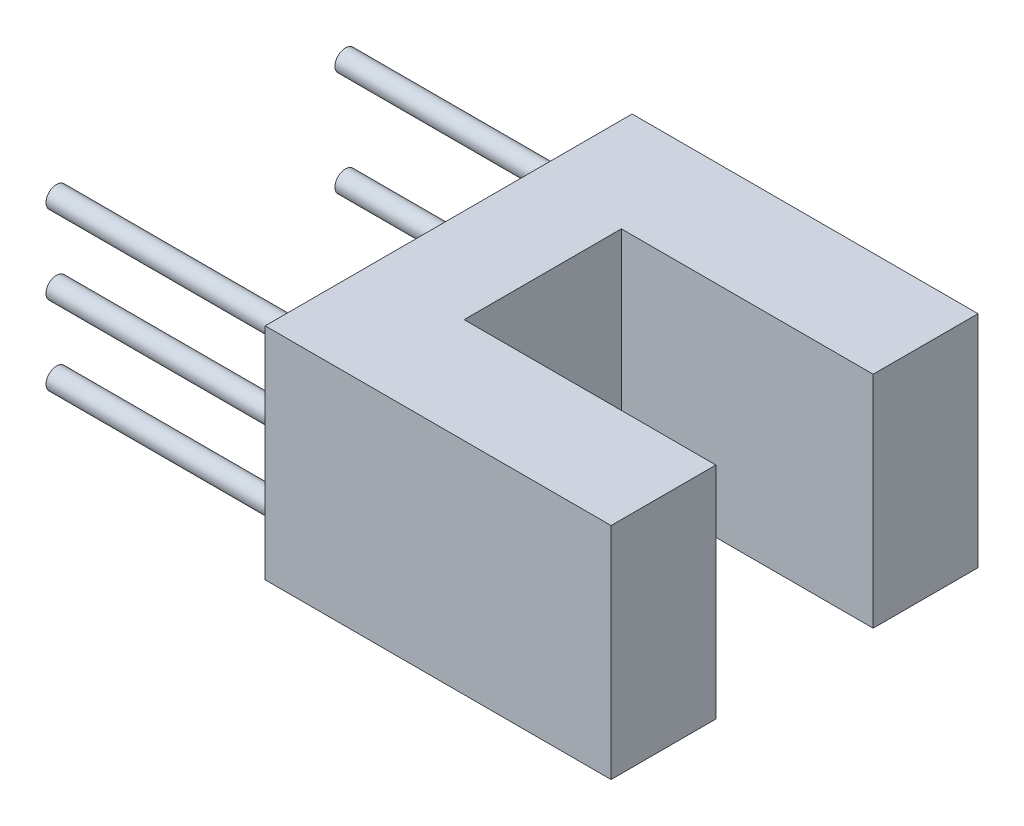
ISO-10303-21;
HEADER;
FILE_DESCRIPTION(('STEP AP214'),'2;1');
FILE_NAME('part.step','',(''),(''),'','','');
FILE_SCHEMA(('AUTOMOTIVE_DESIGN { 1 0 10303 214 1 1 1 1 }'));
ENDSEC;
DATA;
#1=APPLICATION_CONTEXT('core data for automotive mechanical design processes');
#2=APPLICATION_PROTOCOL_DEFINITION('international standard','automotive_design',2000,#1);
#3=PRODUCT_CONTEXT('',#1,'mechanical');
#4=PRODUCT('Part','Part','',(#3));
#5=PRODUCT_RELATED_PRODUCT_CATEGORY('part','',(#4));
#6=PRODUCT_DEFINITION_FORMATION('','',#4);
#7=PRODUCT_DEFINITION_CONTEXT('part definition',#1,'design');
#8=PRODUCT_DEFINITION('design','',#6,#7);
#9=PRODUCT_DEFINITION_SHAPE('','',#8);
#10=(LENGTH_UNIT() NAMED_UNIT(*) SI_UNIT(.MILLI.,.METRE.));
#11=(NAMED_UNIT(*) PLANE_ANGLE_UNIT() SI_UNIT($,.RADIAN.));
#12=(NAMED_UNIT(*) SI_UNIT($,.STERADIAN.) SOLID_ANGLE_UNIT());
#13=UNCERTAINTY_MEASURE_WITH_UNIT(LENGTH_MEASURE(1.E-05),#10,'distance_accuracy_value','');
#14=(GEOMETRIC_REPRESENTATION_CONTEXT(3) GLOBAL_UNCERTAINTY_ASSIGNED_CONTEXT((#13)) GLOBAL_UNIT_ASSIGNED_CONTEXT((#10,
#11,#12)) REPRESENTATION_CONTEXT('',''));
#15=CARTESIAN_POINT('',(0.,0.,0.));
#16=DIRECTION('',(0.,0.,1.));
#17=DIRECTION('',(1.,0.,0.));
#18=AXIS2_PLACEMENT_3D('',#15,#16,#17);
#19=CARTESIAN_POINT('',(8.38,0.,0.));
#20=DIRECTION('',(-1.,0.,0.));
#21=DIRECTION('',(0.,0.,1.));
#22=AXIS2_PLACEMENT_3D('',#19,#20,#21);
#23=PLANE('',#22);
#24=DIRECTION('',(0.,0.,-1.));
#25=VECTOR('',#24,1.);
#26=CARTESIAN_POINT('',(8.38,0.,0.));
#27=LINE('',#26,#25);
#28=CARTESIAN_POINT('',(8.38,0.,0.));
#29=VERTEX_POINT('',#28);
#30=CARTESIAN_POINT('',(8.38,0.,-2.54));
#31=VERTEX_POINT('',#30);
#32=EDGE_CURVE('E90',#29,#31,#27,.T.);
#33=ORIENTED_EDGE('',*,*,#32,.T.);
#34=DIRECTION('',(0.,-1.,0.));
#35=VECTOR('',#34,1.);
#36=CARTESIAN_POINT('',(8.38,5.33,-2.54));
#37=LINE('',#36,#35);
#38=CARTESIAN_POINT('',(8.38,5.33,-2.54));
#39=VERTEX_POINT('',#38);
#40=EDGE_CURVE('E116',#39,#31,#37,.T.);
#41=ORIENTED_EDGE('',*,*,#40,.F.);
#42=DIRECTION('',(0.,0.,1.));
#43=VECTOR('',#42,1.);
#44=CARTESIAN_POINT('',(8.38,5.33,0.));
#45=LINE('',#44,#43);
#46=CARTESIAN_POINT('',(8.38,5.33,0.));
#47=VERTEX_POINT('',#46);
#48=EDGE_CURVE('E61',#39,#47,#45,.T.);
#49=ORIENTED_EDGE('',*,*,#48,.T.);
#50=DIRECTION('',(0.,-1.,0.));
#51=VECTOR('',#50,1.);
#52=CARTESIAN_POINT('',(8.38,0.,0.));
#53=LINE('',#52,#51);
#54=EDGE_CURVE('E147',#47,#29,#53,.T.);
#55=ORIENTED_EDGE('',*,*,#54,.T.);
#56=EDGE_LOOP('',(#33,#41,#49,#55));
#57=FACE_BOUND('',#56,.T.);
#58=ADVANCED_FACE('F37',(#57),#23,.F.);
#59=CARTESIAN_POINT('',(8.38,0.,0.));
#60=DIRECTION('',(0.,0.,-1.));
#61=DIRECTION('',(-1.,0.,0.));
#62=AXIS2_PLACEMENT_3D('',#59,#60,#61);
#63=PLANE('',#62);
#64=DIRECTION('',(0.,-1.,0.));
#65=VECTOR('',#64,1.);
#66=CARTESIAN_POINT('',(0.,0.,0.));
#67=LINE('',#66,#65);
#68=CARTESIAN_POINT('',(0.,5.33,0.));
#69=VERTEX_POINT('',#68);
#70=CARTESIAN_POINT('',(0.,0.,0.));
#71=VERTEX_POINT('',#70);
#72=EDGE_CURVE('E142',#69,#71,#67,.T.);
#73=ORIENTED_EDGE('',*,*,#72,.T.);
#74=DIRECTION('',(-1.,0.,0.));
#75=VECTOR('',#74,1.);
#76=CARTESIAN_POINT('',(8.38,0.,0.));
#77=LINE('',#76,#75);
#78=EDGE_CURVE('E11',#29,#71,#77,.T.);
#79=ORIENTED_EDGE('',*,*,#78,.F.);
#80=ORIENTED_EDGE('',*,*,#54,.F.);
#81=DIRECTION('',(-1.,0.,0.));
#82=VECTOR('',#81,1.);
#83=CARTESIAN_POINT('',(8.38,5.33,0.));
#84=LINE('',#83,#82);
#85=EDGE_CURVE('E156',#47,#69,#84,.T.);
#86=ORIENTED_EDGE('',*,*,#85,.T.);
#87=EDGE_LOOP('',(#73,#79,#80,#86));
#88=FACE_BOUND('',#87,.T.);
#89=ADVANCED_FACE('F39',(#88),#63,.F.);
#90=CARTESIAN_POINT('',(8.38,0.,0.));
#91=DIRECTION('',(0.,1.,0.));
#92=DIRECTION('',(0.,0.,1.));
#93=AXIS2_PLACEMENT_3D('',#90,#91,#92);
#94=PLANE('',#93);
#95=DIRECTION('',(0.,0.,-1.));
#96=VECTOR('',#95,1.);
#97=CARTESIAN_POINT('',(2.28,0.,-2.54));
#98=LINE('',#97,#96);
#99=CARTESIAN_POINT('',(2.28,0.,-2.54));
#100=VERTEX_POINT('',#99);
#101=CARTESIAN_POINT('',(2.28,0.,-6.35));
#102=VERTEX_POINT('',#101);
#103=EDGE_CURVE('E124',#100,#102,#98,.T.);
#104=ORIENTED_EDGE('',*,*,#103,.F.);
#105=DIRECTION('',(1.,0.,0.));
#106=VECTOR('',#105,1.);
#107=CARTESIAN_POINT('',(2.28,0.,-2.54));
#108=LINE('',#107,#106);
#109=EDGE_CURVE('E111',#100,#31,#108,.T.);
#110=ORIENTED_EDGE('',*,*,#109,.T.);
#111=ORIENTED_EDGE('',*,*,#32,.F.);
#112=ORIENTED_EDGE('',*,*,#78,.T.);
#113=DIRECTION('',(0.,0.,-1.));
#114=VECTOR('',#113,1.);
#115=CARTESIAN_POINT('',(0.,0.,0.));
#116=LINE('',#115,#114);
#117=CARTESIAN_POINT('',(0.,0.,-8.89));
#118=VERTEX_POINT('',#117);
#119=EDGE_CURVE('E159',#71,#118,#116,.T.);
#120=ORIENTED_EDGE('',*,*,#119,.T.);
#121=DIRECTION('',(-1.,0.,0.));
#122=VECTOR('',#121,1.);
#123=CARTESIAN_POINT('',(8.38,0.,-8.89));
#124=LINE('',#123,#122);
#125=CARTESIAN_POINT('',(8.38,0.,-8.89));
#126=VERTEX_POINT('',#125);
#127=EDGE_CURVE('E45',#126,#118,#124,.T.);
#128=ORIENTED_EDGE('',*,*,#127,.F.);
#129=CARTESIAN_POINT('',(8.38,0.,-6.35));
#130=VERTEX_POINT('',#129);
#131=EDGE_CURVE('E149',#130,#126,#27,.T.);
#132=ORIENTED_EDGE('',*,*,#131,.F.);
#133=DIRECTION('',(1.,0.,0.));
#134=VECTOR('',#133,1.);
#135=CARTESIAN_POINT('',(2.28,0.,-6.35));
#136=LINE('',#135,#134);
#137=EDGE_CURVE('E52',#102,#130,#136,.T.);
#138=ORIENTED_EDGE('',*,*,#137,.F.);
#139=EDGE_LOOP('',(#104,#110,#111,#112,#120,#128,#132,#138));
#140=FACE_BOUND('',#139,.T.);
#141=ADVANCED_FACE('F129',(#140),#94,.F.);
#142=CARTESIAN_POINT('',(8.38,0.,-8.89));
#143=DIRECTION('',(0.,0.,1.));
#144=DIRECTION('',(1.,0.,0.));
#145=AXIS2_PLACEMENT_3D('',#142,#143,#144);
#146=PLANE('',#145);
#147=DIRECTION('',(0.,1.,0.));
#148=VECTOR('',#147,1.);
#149=CARTESIAN_POINT('',(0.,0.,-8.89));
#150=LINE('',#149,#148);
#151=CARTESIAN_POINT('',(0.,5.33,-8.89));
#152=VERTEX_POINT('',#151);
#153=EDGE_CURVE('E161',#118,#152,#150,.T.);
#154=ORIENTED_EDGE('',*,*,#153,.T.);
#155=DIRECTION('',(-1.,0.,0.));
#156=VECTOR('',#155,1.);
#157=CARTESIAN_POINT('',(8.38,5.33,-8.89));
#158=LINE('',#157,#156);
#159=CARTESIAN_POINT('',(8.38,5.33,-8.89));
#160=VERTEX_POINT('',#159);
#161=EDGE_CURVE('E165',#160,#152,#158,.T.);
#162=ORIENTED_EDGE('',*,*,#161,.F.);
#163=DIRECTION('',(0.,1.,0.));
#164=VECTOR('',#163,1.);
#165=CARTESIAN_POINT('',(8.38,0.,-8.89));
#166=LINE('',#165,#164);
#167=EDGE_CURVE('E151',#126,#160,#166,.T.);
#168=ORIENTED_EDGE('',*,*,#167,.F.);
#169=ORIENTED_EDGE('',*,*,#127,.T.);
#170=EDGE_LOOP('',(#154,#162,#168,#169));
#171=FACE_BOUND('',#170,.T.);
#172=ADVANCED_FACE('F171',(#171),#146,.F.);
#173=CARTESIAN_POINT('',(8.38,5.33,0.));
#174=DIRECTION('',(0.,-1.,0.));
#175=DIRECTION('',(0.,0.,-1.));
#176=AXIS2_PLACEMENT_3D('',#173,#174,#175);
#177=PLANE('',#176);
#178=ORIENTED_EDGE('',*,*,#48,.F.);
#179=DIRECTION('',(1.,0.,0.));
#180=VECTOR('',#179,1.);
#181=CARTESIAN_POINT('',(2.28,5.33,-2.54));
#182=LINE('',#181,#180);
#183=CARTESIAN_POINT('',(2.28,5.33,-2.54));
#184=VERTEX_POINT('',#183);
#185=EDGE_CURVE('E140',#184,#39,#182,.T.);
#186=ORIENTED_EDGE('',*,*,#185,.F.);
#187=DIRECTION('',(0.,0.,1.));
#188=VECTOR('',#187,1.);
#189=CARTESIAN_POINT('',(2.28,5.33,-2.54));
#190=LINE('',#189,#188);
#191=CARTESIAN_POINT('',(2.28,5.33,-6.35));
#192=VERTEX_POINT('',#191);
#193=EDGE_CURVE('E118',#192,#184,#190,.T.);
#194=ORIENTED_EDGE('',*,*,#193,.F.);
#195=DIRECTION('',(1.,0.,0.));
#196=VECTOR('',#195,1.);
#197=CARTESIAN_POINT('',(2.28,5.33,-6.35));
#198=LINE('',#197,#196);
#199=CARTESIAN_POINT('',(8.38,5.33,-6.35));
#200=VERTEX_POINT('',#199);
#201=EDGE_CURVE('E143',#192,#200,#198,.T.);
#202=ORIENTED_EDGE('',*,*,#201,.T.);
#203=EDGE_CURVE('E153',#160,#200,#45,.T.);
#204=ORIENTED_EDGE('',*,*,#203,.F.);
#205=ORIENTED_EDGE('',*,*,#161,.T.);
#206=DIRECTION('',(0.,0.,1.));
#207=VECTOR('',#206,1.);
#208=CARTESIAN_POINT('',(0.,5.33,0.));
#209=LINE('',#208,#207);
#210=EDGE_CURVE('E83',#152,#69,#209,.T.);
#211=ORIENTED_EDGE('',*,*,#210,.T.);
#212=ORIENTED_EDGE('',*,*,#85,.F.);
#213=EDGE_LOOP('',(#178,#186,#194,#202,#204,#205,#211,#212));
#214=FACE_BOUND('',#213,.T.);
#215=ADVANCED_FACE('F179',(#214),#177,.F.);
#216=ORIENTED_EDGE('',*,*,#203,.T.);
#217=DIRECTION('',(0.,1.,0.));
#218=VECTOR('',#217,1.);
#219=CARTESIAN_POINT('',(8.38,5.33,-6.35));
#220=LINE('',#219,#218);
#221=EDGE_CURVE('E127',#130,#200,#220,.T.);
#222=ORIENTED_EDGE('',*,*,#221,.F.);
#223=ORIENTED_EDGE('',*,*,#131,.T.);
#224=ORIENTED_EDGE('',*,*,#167,.T.);
#225=EDGE_LOOP('',(#216,#222,#223,#224));
#226=FACE_BOUND('',#225,.T.);
#227=ADVANCED_FACE('F182',(#226),#23,.F.);
#228=CARTESIAN_POINT('',(0.,0.,0.));
#229=DIRECTION('',(-1.,0.,0.));
#230=DIRECTION('',(0.,0.,1.));
#231=AXIS2_PLACEMENT_3D('',#228,#229,#230);
#232=PLANE('',#231);
#233=CARTESIAN_POINT('',(0.,0.76,-0.945));
#234=DIRECTION('',(-1.,0.,0.));
#235=DIRECTION('',(0.,0.,1.));
#236=AXIS2_PLACEMENT_3D('',#233,#234,#235);
#237=CIRCLE('',#236,0.255);
#238=CARTESIAN_POINT('',(0.,0.76,-0.69));
#239=VERTEX_POINT('',#238);
#240=EDGE_CURVE('E253',#239,#239,#237,.T.);
#241=ORIENTED_EDGE('',*,*,#240,.F.);
#242=EDGE_LOOP('',(#241));
#243=FACE_BOUND('',#242,.T.);
#244=CARTESIAN_POINT('',(0.,2.665,-0.945000000000001));
#245=DIRECTION('',(-1.,0.,0.));
#246=DIRECTION('',(0.,0.,1.));
#247=AXIS2_PLACEMENT_3D('',#244,#245,#246);
#248=CIRCLE('',#247,0.255);
#249=CARTESIAN_POINT('',(0.,2.665,-0.690000000000001));
#250=VERTEX_POINT('',#249);
#251=EDGE_CURVE('E257',#250,#250,#248,.T.);
#252=ORIENTED_EDGE('',*,*,#251,.F.);
#253=EDGE_LOOP('',(#252));
#254=FACE_BOUND('',#253,.T.);
#255=CARTESIAN_POINT('',(0.,4.57,-0.945));
#256=DIRECTION('',(-1.,0.,0.));
#257=DIRECTION('',(0.,0.,1.));
#258=AXIS2_PLACEMENT_3D('',#255,#256,#257);
#259=CIRCLE('',#258,0.255);
#260=CARTESIAN_POINT('',(0.,4.57,-0.69));
#261=VERTEX_POINT('',#260);
#262=EDGE_CURVE('E264',#261,#261,#259,.T.);
#263=ORIENTED_EDGE('',*,*,#262,.F.);
#264=EDGE_LOOP('',(#263));
#265=FACE_BOUND('',#264,.T.);
#266=CARTESIAN_POINT('',(0.,1.395,-7.945));
#267=DIRECTION('',(-1.,0.,0.));
#268=DIRECTION('',(0.,0.,1.));
#269=AXIS2_PLACEMENT_3D('',#266,#267,#268);
#270=CIRCLE('',#269,0.255);
#271=CARTESIAN_POINT('',(0.,1.395,-7.69));
#272=VERTEX_POINT('',#271);
#273=EDGE_CURVE('E270',#272,#272,#270,.T.);
#274=ORIENTED_EDGE('',*,*,#273,.F.);
#275=EDGE_LOOP('',(#274));
#276=FACE_BOUND('',#275,.T.);
#277=CARTESIAN_POINT('',(0.,3.935,-7.945));
#278=DIRECTION('',(-1.,0.,0.));
#279=DIRECTION('',(0.,0.,1.));
#280=AXIS2_PLACEMENT_3D('',#277,#278,#279);
#281=CIRCLE('',#280,0.255);
#282=CARTESIAN_POINT('',(0.,3.935,-7.69));
#283=VERTEX_POINT('',#282);
#284=EDGE_CURVE('E273',#283,#283,#281,.T.);
#285=ORIENTED_EDGE('',*,*,#284,.F.);
#286=EDGE_LOOP('',(#285));
#287=FACE_BOUND('',#286,.T.);
#288=ORIENTED_EDGE('',*,*,#72,.F.);
#289=ORIENTED_EDGE('',*,*,#210,.F.);
#290=ORIENTED_EDGE('',*,*,#153,.F.);
#291=ORIENTED_EDGE('',*,*,#119,.F.);
#292=EDGE_LOOP('',(#288,#289,#290,#291));
#293=FACE_BOUND('',#292,.T.);
#294=ADVANCED_FACE('F175',(#243,#254,#265,#276,#287,#293),#232,.T.);
#295=CARTESIAN_POINT('',(2.28,5.33,-2.54));
#296=DIRECTION('',(0.,0.,1.));
#297=DIRECTION('',(0.,-1.,0.));
#298=AXIS2_PLACEMENT_3D('',#295,#296,#297);
#299=PLANE('',#298);
#300=ORIENTED_EDGE('',*,*,#40,.T.);
#301=ORIENTED_EDGE('',*,*,#109,.F.);
#302=DIRECTION('',(0.,-1.,0.));
#303=VECTOR('',#302,1.);
#304=CARTESIAN_POINT('',(2.28,5.33,-2.54));
#305=LINE('',#304,#303);
#306=EDGE_CURVE('E114',#184,#100,#305,.T.);
#307=ORIENTED_EDGE('',*,*,#306,.F.);
#308=ORIENTED_EDGE('',*,*,#185,.T.);
#309=EDGE_LOOP('',(#300,#301,#307,#308));
#310=FACE_BOUND('',#309,.T.);
#311=ADVANCED_FACE('F113',(#310),#299,.F.);
#312=CARTESIAN_POINT('',(2.28,5.33,-6.35));
#313=DIRECTION('',(0.,0.,-1.));
#314=DIRECTION('',(0.,1.,0.));
#315=AXIS2_PLACEMENT_3D('',#312,#313,#314);
#316=PLANE('',#315);
#317=ORIENTED_EDGE('',*,*,#221,.T.);
#318=ORIENTED_EDGE('',*,*,#201,.F.);
#319=DIRECTION('',(0.,1.,0.));
#320=VECTOR('',#319,1.);
#321=CARTESIAN_POINT('',(2.28,5.33,-6.35));
#322=LINE('',#321,#320);
#323=EDGE_CURVE('E131',#102,#192,#322,.T.);
#324=ORIENTED_EDGE('',*,*,#323,.F.);
#325=ORIENTED_EDGE('',*,*,#137,.T.);
#326=EDGE_LOOP('',(#317,#318,#324,#325));
#327=FACE_BOUND('',#326,.T.);
#328=ADVANCED_FACE('F197',(#327),#316,.F.);
#329=CARTESIAN_POINT('',(2.28,0.,0.));
#330=DIRECTION('',(1.,0.,0.));
#331=DIRECTION('',(0.,0.,-1.));
#332=AXIS2_PLACEMENT_3D('',#329,#330,#331);
#333=PLANE('',#332);
#334=ORIENTED_EDGE('',*,*,#306,.T.);
#335=ORIENTED_EDGE('',*,*,#103,.T.);
#336=ORIENTED_EDGE('',*,*,#323,.T.);
#337=ORIENTED_EDGE('',*,*,#193,.T.);
#338=EDGE_LOOP('',(#334,#335,#336,#337));
#339=FACE_BOUND('',#338,.T.);
#340=ADVANCED_FACE('F122',(#339),#333,.T.);
#341=CARTESIAN_POINT('',(-6.,3.935,-7.945));
#342=DIRECTION('',(1.,0.,0.));
#343=DIRECTION('',(0.,0.,-1.));
#344=AXIS2_PLACEMENT_3D('',#341,#342,#343);
#345=CYLINDRICAL_SURFACE('',#344,0.255);
#346=CARTESIAN_POINT('',(-6.,3.935,-7.945));
#347=DIRECTION('',(-1.,0.,0.));
#348=DIRECTION('',(0.,0.,1.));
#349=AXIS2_PLACEMENT_3D('',#346,#347,#348);
#350=CIRCLE('',#349,0.255);
#351=CARTESIAN_POINT('',(-6.,3.935,-7.69));
#352=VERTEX_POINT('',#351);
#353=EDGE_CURVE('E138',#352,#352,#350,.T.);
#354=ORIENTED_EDGE('',*,*,#353,.F.);
#355=EDGE_LOOP('',(#354));
#356=FACE_BOUND('',#355,.T.);
#357=ORIENTED_EDGE('',*,*,#284,.T.);
#358=EDGE_LOOP('',(#357));
#359=FACE_BOUND('',#358,.T.);
#360=ADVANCED_FACE('F204',(#356,#359),#345,.T.);
#361=CARTESIAN_POINT('',(-6.,3.935,-7.945));
#362=DIRECTION('',(-1.,0.,0.));
#363=DIRECTION('',(0.,0.,1.));
#364=AXIS2_PLACEMENT_3D('',#361,#362,#363);
#365=PLANE('',#364);
#366=ORIENTED_EDGE('',*,*,#353,.T.);
#367=EDGE_LOOP('',(#366));
#368=FACE_BOUND('',#367,.T.);
#369=ADVANCED_FACE('F209',(#368),#365,.T.);
#370=CARTESIAN_POINT('',(-6.,1.395,-7.945));
#371=DIRECTION('',(1.,0.,0.));
#372=DIRECTION('',(0.,0.,-1.));
#373=AXIS2_PLACEMENT_3D('',#370,#371,#372);
#374=CYLINDRICAL_SURFACE('',#373,0.255);
#375=CARTESIAN_POINT('',(-6.,1.395,-7.945));
#376=DIRECTION('',(-1.,0.,0.));
#377=DIRECTION('',(0.,0.,1.));
#378=AXIS2_PLACEMENT_3D('',#375,#376,#377);
#379=CIRCLE('',#378,0.255);
#380=CARTESIAN_POINT('',(-6.,1.395,-7.69));
#381=VERTEX_POINT('',#380);
#382=EDGE_CURVE('E267',#381,#381,#379,.T.);
#383=ORIENTED_EDGE('',*,*,#382,.F.);
#384=EDGE_LOOP('',(#383));
#385=FACE_BOUND('',#384,.T.);
#386=ORIENTED_EDGE('',*,*,#273,.T.);
#387=EDGE_LOOP('',(#386));
#388=FACE_BOUND('',#387,.T.);
#389=ADVANCED_FACE('F213',(#385,#388),#374,.T.);
#390=CARTESIAN_POINT('',(-6.,1.395,-7.945));
#391=DIRECTION('',(-1.,0.,0.));
#392=DIRECTION('',(0.,0.,1.));
#393=AXIS2_PLACEMENT_3D('',#390,#391,#392);
#394=PLANE('',#393);
#395=ORIENTED_EDGE('',*,*,#382,.T.);
#396=EDGE_LOOP('',(#395));
#397=FACE_BOUND('',#396,.T.);
#398=ADVANCED_FACE('F215',(#397),#394,.T.);
#399=CARTESIAN_POINT('',(-6.,4.57,-0.945));
#400=DIRECTION('',(1.,0.,0.));
#401=DIRECTION('',(0.,0.,-1.));
#402=AXIS2_PLACEMENT_3D('',#399,#400,#401);
#403=CYLINDRICAL_SURFACE('',#402,0.255);
#404=CARTESIAN_POINT('',(-6.,4.57,-0.945));
#405=DIRECTION('',(-1.,0.,0.));
#406=DIRECTION('',(0.,0.,1.));
#407=AXIS2_PLACEMENT_3D('',#404,#405,#406);
#408=CIRCLE('',#407,0.255);
#409=CARTESIAN_POINT('',(-6.,4.57,-0.69));
#410=VERTEX_POINT('',#409);
#411=EDGE_CURVE('E262',#410,#410,#408,.T.);
#412=ORIENTED_EDGE('',*,*,#411,.F.);
#413=EDGE_LOOP('',(#412));
#414=FACE_BOUND('',#413,.T.);
#415=ORIENTED_EDGE('',*,*,#262,.T.);
#416=EDGE_LOOP('',(#415));
#417=FACE_BOUND('',#416,.T.);
#418=ADVANCED_FACE('F218',(#414,#417),#403,.T.);
#419=CARTESIAN_POINT('',(-6.,4.57,-0.945));
#420=DIRECTION('',(-1.,0.,0.));
#421=DIRECTION('',(0.,0.,1.));
#422=AXIS2_PLACEMENT_3D('',#419,#420,#421);
#423=PLANE('',#422);
#424=ORIENTED_EDGE('',*,*,#411,.T.);
#425=EDGE_LOOP('',(#424));
#426=FACE_BOUND('',#425,.T.);
#427=ADVANCED_FACE('F223',(#426),#423,.T.);
#428=CARTESIAN_POINT('',(-6.,2.665,-0.945000000000001));
#429=DIRECTION('',(1.,0.,0.));
#430=DIRECTION('',(0.,0.,-1.));
#431=AXIS2_PLACEMENT_3D('',#428,#429,#430);
#432=CYLINDRICAL_SURFACE('',#431,0.255);
#433=CARTESIAN_POINT('',(-6.,2.665,-0.945000000000001));
#434=DIRECTION('',(-1.,0.,0.));
#435=DIRECTION('',(0.,0.,1.));
#436=AXIS2_PLACEMENT_3D('',#433,#434,#435);
#437=CIRCLE('',#436,0.255);
#438=CARTESIAN_POINT('',(-6.,2.665,-0.690000000000001));
#439=VERTEX_POINT('',#438);
#440=EDGE_CURVE('E254',#439,#439,#437,.T.);
#441=ORIENTED_EDGE('',*,*,#440,.F.);
#442=EDGE_LOOP('',(#441));
#443=FACE_BOUND('',#442,.T.);
#444=ORIENTED_EDGE('',*,*,#251,.T.);
#445=EDGE_LOOP('',(#444));
#446=FACE_BOUND('',#445,.T.);
#447=ADVANCED_FACE('F226',(#443,#446),#432,.T.);
#448=CARTESIAN_POINT('',(-6.,2.665,-0.945000000000001));
#449=DIRECTION('',(-1.,0.,0.));
#450=DIRECTION('',(0.,0.,1.));
#451=AXIS2_PLACEMENT_3D('',#448,#449,#450);
#452=PLANE('',#451);
#453=ORIENTED_EDGE('',*,*,#440,.T.);
#454=EDGE_LOOP('',(#453));
#455=FACE_BOUND('',#454,.T.);
#456=ADVANCED_FACE('F231',(#455),#452,.T.);
#457=CARTESIAN_POINT('',(-6.,0.76,-0.945));
#458=DIRECTION('',(1.,0.,0.));
#459=DIRECTION('',(0.,0.,-1.));
#460=AXIS2_PLACEMENT_3D('',#457,#458,#459);
#461=CYLINDRICAL_SURFACE('',#460,0.255);
#462=CARTESIAN_POINT('',(-6.,0.76,-0.945));
#463=DIRECTION('',(-1.,0.,0.));
#464=DIRECTION('',(0.,0.,1.));
#465=AXIS2_PLACEMENT_3D('',#462,#463,#464);
#466=CIRCLE('',#465,0.255);
#467=CARTESIAN_POINT('',(-6.,0.76,-0.69));
#468=VERTEX_POINT('',#467);
#469=EDGE_CURVE('E250',#468,#468,#466,.T.);
#470=ORIENTED_EDGE('',*,*,#469,.F.);
#471=EDGE_LOOP('',(#470));
#472=FACE_BOUND('',#471,.T.);
#473=ORIENTED_EDGE('',*,*,#240,.T.);
#474=EDGE_LOOP('',(#473));
#475=FACE_BOUND('',#474,.T.);
#476=ADVANCED_FACE('F234',(#472,#475),#461,.T.);
#477=CARTESIAN_POINT('',(-6.,0.76,-0.945));
#478=DIRECTION('',(-1.,0.,0.));
#479=DIRECTION('',(0.,0.,1.));
#480=AXIS2_PLACEMENT_3D('',#477,#478,#479);
#481=PLANE('',#480);
#482=ORIENTED_EDGE('',*,*,#469,.T.);
#483=EDGE_LOOP('',(#482));
#484=FACE_BOUND('',#483,.T.);
#485=ADVANCED_FACE('F239',(#484),#481,.T.);
#486=CLOSED_SHELL('',(#58,#89,#141,#172,#215,#227,#294,#311,#328,#340,#360,#369,#389,#398,#418,
#427,#447,#456,#476,#485));
#487=MANIFOLD_SOLID_BREP('B2',#486);
#488=ADVANCED_BREP_SHAPE_REPRESENTATION('',(#18,#487),#14);
#489=SHAPE_DEFINITION_REPRESENTATION(#9,#488);
ENDSEC;
END-ISO-10303-21;
